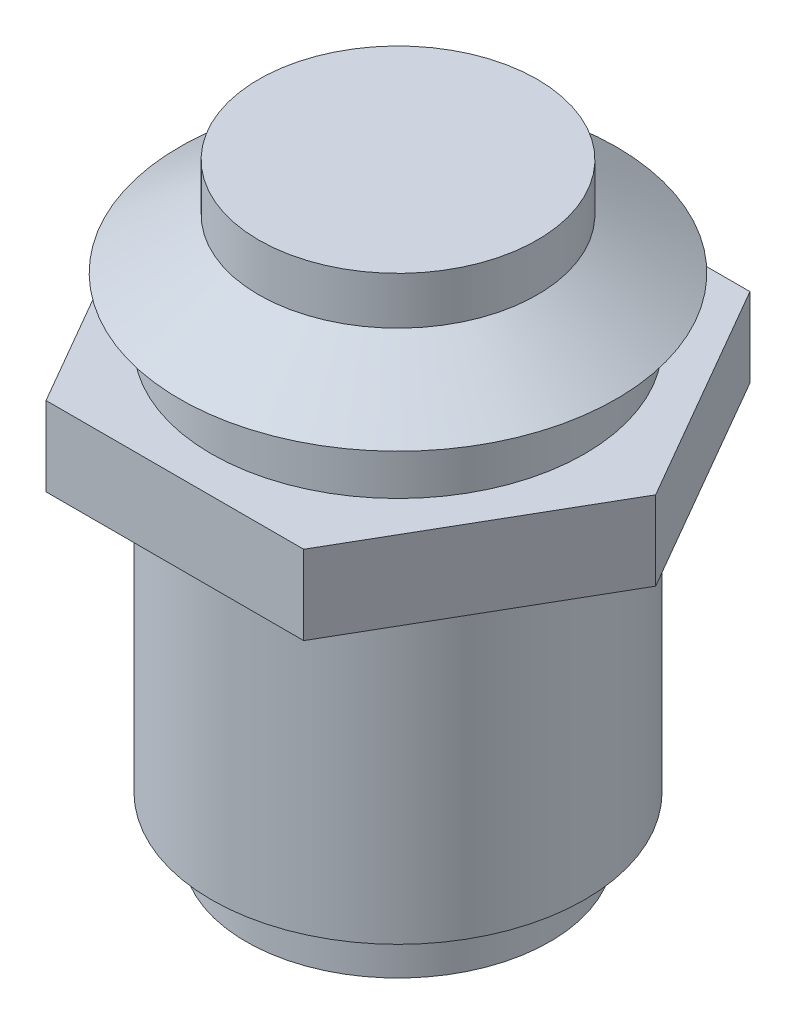
ISO-10303-21;
HEADER;
FILE_DESCRIPTION(('STEP AP214'),'2;1');
FILE_NAME('part.step','',(''),(''),'','','');
FILE_SCHEMA(('AUTOMOTIVE_DESIGN { 1 0 10303 214 1 1 1 1 }'));
ENDSEC;
DATA;
#1=APPLICATION_CONTEXT('core data for automotive mechanical design processes');
#2=APPLICATION_PROTOCOL_DEFINITION('international standard','automotive_design',2000,#1);
#3=PRODUCT_CONTEXT('',#1,'mechanical');
#4=PRODUCT('Part','Part','',(#3));
#5=PRODUCT_RELATED_PRODUCT_CATEGORY('part','',(#4));
#6=PRODUCT_DEFINITION_FORMATION('','',#4);
#7=PRODUCT_DEFINITION_CONTEXT('part definition',#1,'design');
#8=PRODUCT_DEFINITION('design','',#6,#7);
#9=PRODUCT_DEFINITION_SHAPE('','',#8);
#10=(LENGTH_UNIT() NAMED_UNIT(*) SI_UNIT(.MILLI.,.METRE.));
#11=(NAMED_UNIT(*) PLANE_ANGLE_UNIT() SI_UNIT($,.RADIAN.));
#12=(NAMED_UNIT(*) SI_UNIT($,.STERADIAN.) SOLID_ANGLE_UNIT());
#13=UNCERTAINTY_MEASURE_WITH_UNIT(LENGTH_MEASURE(1.E-05),#10,'distance_accuracy_value','');
#14=(GEOMETRIC_REPRESENTATION_CONTEXT(3) GLOBAL_UNCERTAINTY_ASSIGNED_CONTEXT((#13)) GLOBAL_UNIT_ASSIGNED_CONTEXT((#10,
#11,#12)) REPRESENTATION_CONTEXT('',''));
#15=CARTESIAN_POINT('',(0.,0.,0.));
#16=DIRECTION('',(0.,0.,1.));
#17=DIRECTION('',(1.,0.,0.));
#18=AXIS2_PLACEMENT_3D('',#15,#16,#17);
#19=CARTESIAN_POINT('',(-8.14063879557372,11.4000000000001,0.));
#20=DIRECTION('',(0.866025403784439,0.,0.5));
#21=DIRECTION('',(0.5,0.,-0.866025403784439));
#22=AXIS2_PLACEMENT_3D('',#19,#20,#21);
#23=PLANE('',#22);
#24=DIRECTION('',(0.5,0.,-0.866025403784439));
#25=VECTOR('',#24,1.);
#26=CARTESIAN_POINT('',(-8.14063879557372,13.9000000000001,0.));
#27=LINE('',#26,#25);
#28=CARTESIAN_POINT('',(-8.14063879557372,13.9000000000001,0.));
#29=VERTEX_POINT('',#28);
#30=CARTESIAN_POINT('',(-4.07031939778686,13.9000000000001,-7.05));
#31=VERTEX_POINT('',#30);
#32=EDGE_CURVE('E153',#29,#31,#27,.T.);
#33=ORIENTED_EDGE('',*,*,#32,.T.);
#34=DIRECTION('',(0.,1.,0.));
#35=VECTOR('',#34,1.);
#36=CARTESIAN_POINT('',(-4.07031939778686,11.4000000000001,-7.05));
#37=LINE('',#36,#35);
#38=CARTESIAN_POINT('',(-4.07031939778686,11.4000000000001,-7.05));
#39=VERTEX_POINT('',#38);
#40=EDGE_CURVE('E12',#39,#31,#37,.T.);
#41=ORIENTED_EDGE('',*,*,#40,.F.);
#42=DIRECTION('',(0.5,0.,-0.866025403784439));
#43=VECTOR('',#42,1.);
#44=CARTESIAN_POINT('',(-8.14063879557372,11.4000000000001,0.));
#45=LINE('',#44,#43);
#46=CARTESIAN_POINT('',(-8.14063879557372,11.4000000000001,0.));
#47=VERTEX_POINT('',#46);
#48=EDGE_CURVE('E167',#47,#39,#45,.T.);
#49=ORIENTED_EDGE('',*,*,#48,.F.);
#50=DIRECTION('',(0.,1.,0.));
#51=VECTOR('',#50,1.);
#52=CARTESIAN_POINT('',(-8.14063879557372,11.4000000000001,0.));
#53=LINE('',#52,#51);
#54=EDGE_CURVE('E150',#47,#29,#53,.T.);
#55=ORIENTED_EDGE('',*,*,#54,.T.);
#56=EDGE_LOOP('',(#33,#41,#49,#55));
#57=FACE_BOUND('',#56,.T.);
#58=ADVANCED_FACE('F54',(#57),#23,.F.);
#59=CARTESIAN_POINT('',(-4.07031939778686,11.4000000000001,-7.05));
#60=DIRECTION('',(0.,0.,1.));
#61=DIRECTION('',(0.,-1.,0.));
#62=AXIS2_PLACEMENT_3D('',#59,#60,#61);
#63=PLANE('',#62);
#64=DIRECTION('',(1.,0.,0.));
#65=VECTOR('',#64,1.);
#66=CARTESIAN_POINT('',(-4.07031939778686,13.9000000000001,-7.05));
#67=LINE('',#66,#65);
#68=CARTESIAN_POINT('',(4.07031939778687,13.9000000000001,-7.05));
#69=VERTEX_POINT('',#68);
#70=EDGE_CURVE('E154',#31,#69,#67,.T.);
#71=ORIENTED_EDGE('',*,*,#70,.T.);
#72=DIRECTION('',(0.,1.,0.));
#73=VECTOR('',#72,1.);
#74=CARTESIAN_POINT('',(4.07031939778686,11.4,-7.05));
#75=LINE('',#74,#73);
#76=CARTESIAN_POINT('',(4.07031939778686,11.4,-7.05));
#77=VERTEX_POINT('',#76);
#78=EDGE_CURVE('E62',#77,#69,#75,.T.);
#79=ORIENTED_EDGE('',*,*,#78,.F.);
#80=DIRECTION('',(1.,0.,0.));
#81=VECTOR('',#80,1.);
#82=CARTESIAN_POINT('',(-4.07031939778686,11.4000000000001,-7.05));
#83=LINE('',#82,#81);
#84=EDGE_CURVE('E120',#39,#77,#83,.T.);
#85=ORIENTED_EDGE('',*,*,#84,.F.);
#86=ORIENTED_EDGE('',*,*,#40,.T.);
#87=EDGE_LOOP('',(#71,#79,#85,#86));
#88=FACE_BOUND('',#87,.T.);
#89=ADVANCED_FACE('F193',(#88),#63,.F.);
#90=CARTESIAN_POINT('',(4.07031939778686,11.4,-7.05));
#91=DIRECTION('',(-0.866025403784439,0.,0.5));
#92=DIRECTION('',(0.5,0.,0.866025403784439));
#93=AXIS2_PLACEMENT_3D('',#90,#91,#92);
#94=PLANE('',#93);
#95=DIRECTION('',(0.5,0.,0.866025403784439));
#96=VECTOR('',#95,1.);
#97=CARTESIAN_POINT('',(4.07031939778687,13.9000000000001,-7.05));
#98=LINE('',#97,#96);
#99=CARTESIAN_POINT('',(8.14063879557373,13.9000000000001,0.));
#100=VERTEX_POINT('',#99);
#101=EDGE_CURVE('E156',#69,#100,#98,.T.);
#102=ORIENTED_EDGE('',*,*,#101,.T.);
#103=DIRECTION('',(0.,1.,0.));
#104=VECTOR('',#103,1.);
#105=CARTESIAN_POINT('',(8.14063879557373,11.4,0.));
#106=LINE('',#105,#104);
#107=CARTESIAN_POINT('',(8.14063879557373,11.4,0.));
#108=VERTEX_POINT('',#107);
#109=EDGE_CURVE('E141',#108,#100,#106,.T.);
#110=ORIENTED_EDGE('',*,*,#109,.F.);
#111=DIRECTION('',(0.5,0.,0.866025403784439));
#112=VECTOR('',#111,1.);
#113=CARTESIAN_POINT('',(4.07031939778686,11.4,-7.05));
#114=LINE('',#113,#112);
#115=EDGE_CURVE('E127',#77,#108,#114,.T.);
#116=ORIENTED_EDGE('',*,*,#115,.F.);
#117=ORIENTED_EDGE('',*,*,#78,.T.);
#118=EDGE_LOOP('',(#102,#110,#116,#117));
#119=FACE_BOUND('',#118,.T.);
#120=ADVANCED_FACE('F180',(#119),#94,.F.);
#121=CARTESIAN_POINT('',(8.14063879557373,11.4,0.));
#122=DIRECTION('',(-0.866025403784438,0.,-0.5));
#123=DIRECTION('',(-0.5,0.,0.866025403784438));
#124=AXIS2_PLACEMENT_3D('',#121,#122,#123);
#125=PLANE('',#124);
#126=DIRECTION('',(-0.5,0.,0.866025403784438));
#127=VECTOR('',#126,1.);
#128=CARTESIAN_POINT('',(8.14063879557373,13.9000000000001,0.));
#129=LINE('',#128,#127);
#130=CARTESIAN_POINT('',(4.07031939778686,13.9000000000001,7.05));
#131=VERTEX_POINT('',#130);
#132=EDGE_CURVE('E137',#100,#131,#129,.T.);
#133=ORIENTED_EDGE('',*,*,#132,.T.);
#134=DIRECTION('',(0.,1.,0.));
#135=VECTOR('',#134,1.);
#136=CARTESIAN_POINT('',(4.07031939778686,11.4,7.05));
#137=LINE('',#136,#135);
#138=CARTESIAN_POINT('',(4.07031939778686,11.4,7.05));
#139=VERTEX_POINT('',#138);
#140=EDGE_CURVE('E136',#139,#131,#137,.T.);
#141=ORIENTED_EDGE('',*,*,#140,.F.);
#142=DIRECTION('',(-0.5,0.,0.866025403784438));
#143=VECTOR('',#142,1.);
#144=CARTESIAN_POINT('',(8.14063879557373,11.4,0.));
#145=LINE('',#144,#143);
#146=EDGE_CURVE('E125',#108,#139,#145,.T.);
#147=ORIENTED_EDGE('',*,*,#146,.F.);
#148=ORIENTED_EDGE('',*,*,#109,.T.);
#149=EDGE_LOOP('',(#133,#141,#147,#148));
#150=FACE_BOUND('',#149,.T.);
#151=ADVANCED_FACE('F140',(#150),#125,.F.);
#152=CARTESIAN_POINT('',(4.07031939778686,11.4,7.05));
#153=DIRECTION('',(0.,0.,-1.));
#154=DIRECTION('',(-1.,0.,0.));
#155=AXIS2_PLACEMENT_3D('',#152,#153,#154);
#156=PLANE('',#155);
#157=DIRECTION('',(-1.,0.,0.));
#158=VECTOR('',#157,1.);
#159=CARTESIAN_POINT('',(4.07031939778686,13.9000000000001,7.05));
#160=LINE('',#159,#158);
#161=CARTESIAN_POINT('',(-4.07031939778686,13.9000000000001,7.05));
#162=VERTEX_POINT('',#161);
#163=EDGE_CURVE('E102',#131,#162,#160,.T.);
#164=ORIENTED_EDGE('',*,*,#163,.T.);
#165=DIRECTION('',(0.,1.,0.));
#166=VECTOR('',#165,1.);
#167=CARTESIAN_POINT('',(-4.07031939778686,11.4000000000001,7.05));
#168=LINE('',#167,#166);
#169=CARTESIAN_POINT('',(-4.07031939778686,11.4000000000001,7.05));
#170=VERTEX_POINT('',#169);
#171=EDGE_CURVE('E145',#170,#162,#168,.T.);
#172=ORIENTED_EDGE('',*,*,#171,.F.);
#173=DIRECTION('',(-1.,0.,0.));
#174=VECTOR('',#173,1.);
#175=CARTESIAN_POINT('',(4.07031939778686,11.4,7.05));
#176=LINE('',#175,#174);
#177=EDGE_CURVE('E126',#139,#170,#176,.T.);
#178=ORIENTED_EDGE('',*,*,#177,.F.);
#179=ORIENTED_EDGE('',*,*,#140,.T.);
#180=EDGE_LOOP('',(#164,#172,#178,#179));
#181=FACE_BOUND('',#180,.T.);
#182=ADVANCED_FACE('F143',(#181),#156,.F.);
#183=CARTESIAN_POINT('',(-4.07031939778686,11.4000000000001,7.05));
#184=DIRECTION('',(0.866025403784439,0.,-0.5));
#185=DIRECTION('',(-0.5,0.,-0.866025403784439));
#186=AXIS2_PLACEMENT_3D('',#183,#184,#185);
#187=PLANE('',#186);
#188=DIRECTION('',(-0.5,0.,-0.866025403784439));
#189=VECTOR('',#188,1.);
#190=CARTESIAN_POINT('',(-4.07031939778686,13.9000000000001,7.05));
#191=LINE('',#190,#189);
#192=EDGE_CURVE('E106',#162,#29,#191,.T.);
#193=ORIENTED_EDGE('',*,*,#192,.T.);
#194=ORIENTED_EDGE('',*,*,#54,.F.);
#195=DIRECTION('',(-0.5,0.,-0.866025403784439));
#196=VECTOR('',#195,1.);
#197=CARTESIAN_POINT('',(-4.07031939778686,11.4000000000001,7.05));
#198=LINE('',#197,#196);
#199=EDGE_CURVE('E74',#170,#47,#198,.T.);
#200=ORIENTED_EDGE('',*,*,#199,.F.);
#201=ORIENTED_EDGE('',*,*,#171,.T.);
#202=EDGE_LOOP('',(#193,#194,#200,#201));
#203=FACE_BOUND('',#202,.T.);
#204=ADVANCED_FACE('F182',(#203),#187,.F.);
#205=CARTESIAN_POINT('',(0.,11.4,0.));
#206=DIRECTION('',(0.,-1.,0.));
#207=DIRECTION('',(1.,0.,0.));
#208=AXIS2_PLACEMENT_3D('',#205,#206,#207);
#209=PLANE('',#208);
#210=ORIENTED_EDGE('',*,*,#48,.T.);
#211=ORIENTED_EDGE('',*,*,#84,.T.);
#212=ORIENTED_EDGE('',*,*,#115,.T.);
#213=ORIENTED_EDGE('',*,*,#146,.T.);
#214=ORIENTED_EDGE('',*,*,#177,.T.);
#215=ORIENTED_EDGE('',*,*,#199,.T.);
#216=EDGE_LOOP('',(#210,#211,#212,#213,#214,#215));
#217=FACE_BOUND('',#216,.T.);
#218=ADVANCED_FACE('F128',(#217),#209,.T.);
#219=CARTESIAN_POINT('',(0.,13.9000000000001,0.));
#220=DIRECTION('',(0.,-1.,0.));
#221=DIRECTION('',(1.,0.,0.));
#222=AXIS2_PLACEMENT_3D('',#219,#220,#221);
#223=PLANE('',#222);
#224=ORIENTED_EDGE('',*,*,#32,.F.);
#225=ORIENTED_EDGE('',*,*,#192,.F.);
#226=ORIENTED_EDGE('',*,*,#163,.F.);
#227=ORIENTED_EDGE('',*,*,#132,.F.);
#228=ORIENTED_EDGE('',*,*,#101,.F.);
#229=ORIENTED_EDGE('',*,*,#70,.F.);
#230=EDGE_LOOP('',(#224,#225,#226,#227,#228,#229));
#231=FACE_BOUND('',#230,.T.);
#232=ADVANCED_FACE('F179',(#231),#223,.F.);
#233=CLOSED_SHELL('',(#58,#89,#120,#151,#182,#204,#218,#232));
#234=MANIFOLD_SOLID_BREP('B2',#233);
#235=CARTESIAN_POINT('',(0.,0.,-4.8));
#236=DIRECTION('',(0.,-1.,0.));
#237=DIRECTION('',(0.,0.,-1.));
#238=AXIS2_PLACEMENT_3D('',#235,#236,#237);
#239=PLANE('',#238);
#240=CARTESIAN_POINT('',(0.,0.,0.));
#241=DIRECTION('',(0.,-1.,0.));
#242=DIRECTION('',(0.,0.,-1.));
#243=AXIS2_PLACEMENT_3D('',#240,#241,#242);
#244=CIRCLE('',#243,4.8);
#245=CARTESIAN_POINT('',(0.,0.,-4.8));
#246=VERTEX_POINT('',#245);
#247=EDGE_CURVE('E288',#246,#246,#244,.T.);
#248=ORIENTED_EDGE('',*,*,#247,.T.);
#249=EDGE_LOOP('',(#248));
#250=FACE_BOUND('',#249,.T.);
#251=ADVANCED_FACE('F257',(#250),#239,.T.);
#252=CARTESIAN_POINT('',(0.,19.,0.));
#253=DIRECTION('',(0.,1.,0.));
#254=DIRECTION('',(0.,0.,1.));
#255=AXIS2_PLACEMENT_3D('',#252,#253,#254);
#256=PLANE('',#255);
#257=CARTESIAN_POINT('',(0.,19.,0.));
#258=DIRECTION('',(0.,-1.,0.));
#259=DIRECTION('',(0.,0.,-1.));
#260=AXIS2_PLACEMENT_3D('',#257,#258,#259);
#261=CIRCLE('',#260,4.4);
#262=CARTESIAN_POINT('',(0.,19.,-4.4));
#263=VERTEX_POINT('',#262);
#264=EDGE_CURVE('E53',#263,#263,#261,.T.);
#265=ORIENTED_EDGE('',*,*,#264,.F.);
#266=EDGE_LOOP('',(#265));
#267=FACE_BOUND('',#266,.T.);
#268=ADVANCED_FACE('F301',(#267),#256,.T.);
#269=CARTESIAN_POINT('',(0.,0.,0.));
#270=DIRECTION('',(0.,-1.,0.));
#271=DIRECTION('',(0.,0.,-1.));
#272=AXIS2_PLACEMENT_3D('',#269,#270,#271);
#273=CYLINDRICAL_SURFACE('',#272,4.4);
#274=ORIENTED_EDGE('',*,*,#264,.T.);
#275=EDGE_LOOP('',(#274));
#276=FACE_BOUND('',#275,.T.);
#277=CARTESIAN_POINT('',(0.,17.5,0.));
#278=DIRECTION('',(0.,-1.,0.));
#279=DIRECTION('',(0.,0.,-1.));
#280=AXIS2_PLACEMENT_3D('',#277,#278,#279);
#281=CIRCLE('',#280,4.4);
#282=CARTESIAN_POINT('',(0.,17.5,-4.4));
#283=VERTEX_POINT('',#282);
#284=EDGE_CURVE('E264',#283,#283,#281,.T.);
#285=ORIENTED_EDGE('',*,*,#284,.F.);
#286=EDGE_LOOP('',(#285));
#287=FACE_BOUND('',#286,.T.);
#288=ADVANCED_FACE('F310',(#276,#287),#273,.T.);
#289=CARTESIAN_POINT('',(0.,15.9,0.));
#290=DIRECTION('',(0.,-1.,0.));
#291=DIRECTION('',(0.,0.,-1.));
#292=AXIS2_PLACEMENT_3D('',#289,#290,#291);
#293=CONICAL_SURFACE('',#292,6.9,1.00148313569424);
#294=ORIENTED_EDGE('',*,*,#284,.T.);
#295=EDGE_LOOP('',(#294));
#296=FACE_BOUND('',#295,.T.);
#297=CARTESIAN_POINT('',(0.,15.9,0.));
#298=DIRECTION('',(0.,-1.,0.));
#299=DIRECTION('',(0.,0.,-1.));
#300=AXIS2_PLACEMENT_3D('',#297,#298,#299);
#301=CIRCLE('',#300,6.9);
#302=CARTESIAN_POINT('',(0.,15.9,-6.9));
#303=VERTEX_POINT('',#302);
#304=EDGE_CURVE('E267',#303,#303,#301,.T.);
#305=ORIENTED_EDGE('',*,*,#304,.F.);
#306=EDGE_LOOP('',(#305));
#307=FACE_BOUND('',#306,.T.);
#308=ADVANCED_FACE('F315',(#296,#307),#293,.T.);
#309=CARTESIAN_POINT('',(0.,15.9,-6.9));
#310=DIRECTION('',(0.,-1.,0.));
#311=DIRECTION('',(0.,0.,-1.));
#312=AXIS2_PLACEMENT_3D('',#309,#310,#311);
#313=PLANE('',#312);
#314=ORIENTED_EDGE('',*,*,#304,.T.);
#315=EDGE_LOOP('',(#314));
#316=FACE_BOUND('',#315,.T.);
#317=CARTESIAN_POINT('',(0.,15.9,0.));
#318=DIRECTION('',(0.,-1.,0.));
#319=DIRECTION('',(0.,0.,-1.));
#320=AXIS2_PLACEMENT_3D('',#317,#318,#319);
#321=CIRCLE('',#320,5.9);
#322=CARTESIAN_POINT('',(0.,15.9,-5.9));
#323=VERTEX_POINT('',#322);
#324=EDGE_CURVE('E274',#323,#323,#321,.T.);
#325=ORIENTED_EDGE('',*,*,#324,.F.);
#326=EDGE_LOOP('',(#325));
#327=FACE_BOUND('',#326,.T.);
#328=ADVANCED_FACE('F320',(#316,#327),#313,.T.);
#329=CARTESIAN_POINT('',(0.,0.,0.));
#330=DIRECTION('',(0.,-1.,0.));
#331=DIRECTION('',(0.,0.,-1.));
#332=AXIS2_PLACEMENT_3D('',#329,#330,#331);
#333=CYLINDRICAL_SURFACE('',#332,5.9);
#334=ORIENTED_EDGE('',*,*,#324,.T.);
#335=EDGE_LOOP('',(#334));
#336=FACE_BOUND('',#335,.T.);
#337=CARTESIAN_POINT('',(0.,1.7,0.));
#338=DIRECTION('',(0.,-1.,0.));
#339=DIRECTION('',(0.,0.,-1.));
#340=AXIS2_PLACEMENT_3D('',#337,#338,#339);
#341=CIRCLE('',#340,5.9);
#342=CARTESIAN_POINT('',(0.,1.7,-5.9));
#343=VERTEX_POINT('',#342);
#344=EDGE_CURVE('E279',#343,#343,#341,.T.);
#345=ORIENTED_EDGE('',*,*,#344,.F.);
#346=EDGE_LOOP('',(#345));
#347=FACE_BOUND('',#346,.T.);
#348=ADVANCED_FACE('F297',(#336,#347),#333,.T.);
#349=CARTESIAN_POINT('',(0.,1.7,-5.9));
#350=DIRECTION('',(0.,-1.,0.));
#351=DIRECTION('',(0.,0.,-1.));
#352=AXIS2_PLACEMENT_3D('',#349,#350,#351);
#353=PLANE('',#352);
#354=ORIENTED_EDGE('',*,*,#344,.T.);
#355=EDGE_LOOP('',(#354));
#356=FACE_BOUND('',#355,.T.);
#357=CARTESIAN_POINT('',(0.,1.7,0.));
#358=DIRECTION('',(0.,-1.,0.));
#359=DIRECTION('',(0.,0.,-1.));
#360=AXIS2_PLACEMENT_3D('',#357,#358,#359);
#361=CIRCLE('',#360,4.8);
#362=CARTESIAN_POINT('',(0.,1.7,-4.8));
#363=VERTEX_POINT('',#362);
#364=EDGE_CURVE('E284',#363,#363,#361,.T.);
#365=ORIENTED_EDGE('',*,*,#364,.F.);
#366=EDGE_LOOP('',(#365));
#367=FACE_BOUND('',#366,.T.);
#368=ADVANCED_FACE('F291',(#356,#367),#353,.T.);
#369=CARTESIAN_POINT('',(0.,0.,0.));
#370=DIRECTION('',(0.,-1.,0.));
#371=DIRECTION('',(0.,0.,-1.));
#372=AXIS2_PLACEMENT_3D('',#369,#370,#371);
#373=CYLINDRICAL_SURFACE('',#372,4.8);
#374=ORIENTED_EDGE('',*,*,#364,.T.);
#375=EDGE_LOOP('',(#374));
#376=FACE_BOUND('',#375,.T.);
#377=ORIENTED_EDGE('',*,*,#247,.F.);
#378=EDGE_LOOP('',(#377));
#379=FACE_BOUND('',#378,.T.);
#380=ADVANCED_FACE('F292',(#376,#379),#373,.T.);
#381=CLOSED_SHELL('',(#251,#268,#288,#308,#328,#348,#368,#380));
#382=MANIFOLD_SOLID_BREP('B6',#381);
#383=ADVANCED_BREP_SHAPE_REPRESENTATION('',(#18,#234,#382),#14);
#384=SHAPE_DEFINITION_REPRESENTATION(#9,#383);
ENDSEC;
END-ISO-10303-21;
